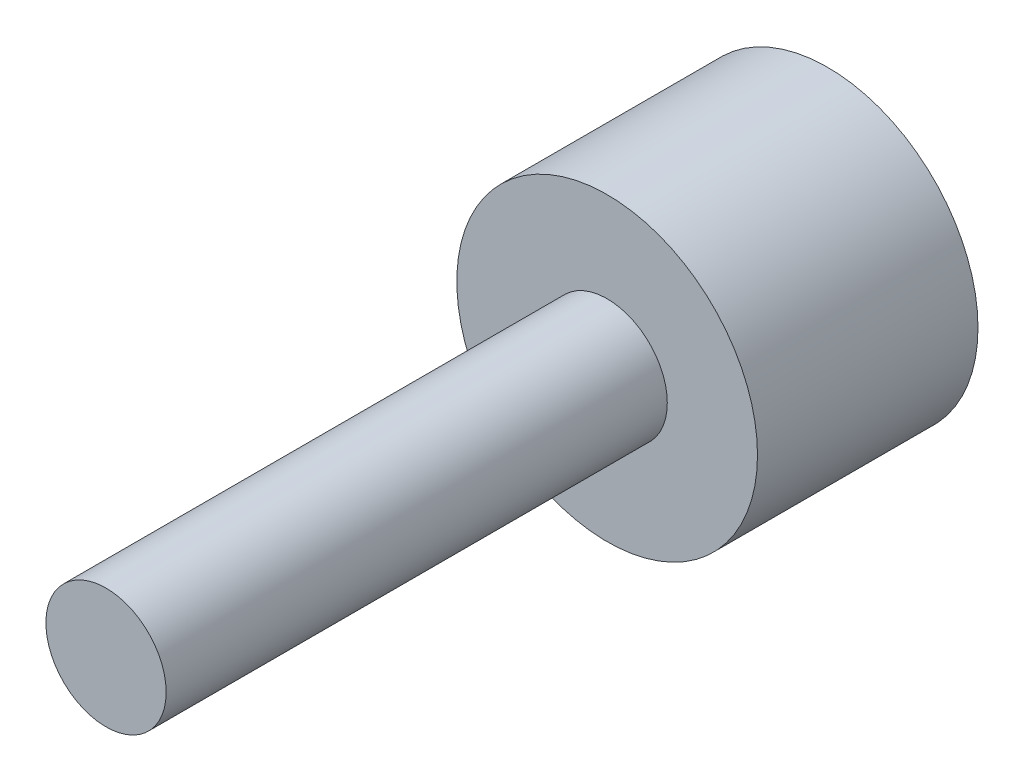
ISO-10303-21;
HEADER;
FILE_DESCRIPTION(('STEP AP214'),'2;1');
FILE_NAME('part.step','',(''),(''),'','','');
FILE_SCHEMA(('AUTOMOTIVE_DESIGN { 1 0 10303 214 1 1 1 1 }'));
ENDSEC;
DATA;
#1=APPLICATION_CONTEXT('core data for automotive mechanical design processes');
#2=APPLICATION_PROTOCOL_DEFINITION('international standard','automotive_design',2000,#1);
#3=PRODUCT_CONTEXT('',#1,'mechanical');
#4=PRODUCT('Part','Part','',(#3));
#5=PRODUCT_RELATED_PRODUCT_CATEGORY('part','',(#4));
#6=PRODUCT_DEFINITION_FORMATION('','',#4);
#7=PRODUCT_DEFINITION_CONTEXT('part definition',#1,'design');
#8=PRODUCT_DEFINITION('design','',#6,#7);
#9=PRODUCT_DEFINITION_SHAPE('','',#8);
#10=(LENGTH_UNIT() NAMED_UNIT(*) SI_UNIT(.MILLI.,.METRE.));
#11=(NAMED_UNIT(*) PLANE_ANGLE_UNIT() SI_UNIT($,.RADIAN.));
#12=(NAMED_UNIT(*) SI_UNIT($,.STERADIAN.) SOLID_ANGLE_UNIT());
#13=UNCERTAINTY_MEASURE_WITH_UNIT(LENGTH_MEASURE(1.E-05),#10,'distance_accuracy_value','');
#14=(GEOMETRIC_REPRESENTATION_CONTEXT(3) GLOBAL_UNCERTAINTY_ASSIGNED_CONTEXT((#13)) GLOBAL_UNIT_ASSIGNED_CONTEXT((#10,
#11,#12)) REPRESENTATION_CONTEXT('',''));
#15=CARTESIAN_POINT('',(0.,0.,0.));
#16=DIRECTION('',(0.,0.,1.));
#17=DIRECTION('',(1.,0.,0.));
#18=AXIS2_PLACEMENT_3D('',#15,#16,#17);
#19=CARTESIAN_POINT('',(0.,0.,5.5));
#20=DIRECTION('',(0.,0.,-1.));
#21=DIRECTION('',(-1.,0.,0.));
#22=AXIS2_PLACEMENT_3D('',#19,#20,#21);
#23=CYLINDRICAL_SURFACE('',#22,7.5);
#24=CARTESIAN_POINT('',(0.,0.,5.5));
#25=DIRECTION('',(0.,0.,1.));
#26=DIRECTION('',(1.,0.,0.));
#27=AXIS2_PLACEMENT_3D('',#24,#25,#26);
#28=CIRCLE('',#27,7.5);
#29=CARTESIAN_POINT('',(7.5,0.,5.5));
#30=VERTEX_POINT('',#29);
#31=EDGE_CURVE('E42',#30,#30,#28,.T.);
#32=ORIENTED_EDGE('',*,*,#31,.F.);
#33=EDGE_LOOP('',(#32));
#34=FACE_BOUND('',#33,.T.);
#35=CARTESIAN_POINT('',(0.,0.,-5.5));
#36=DIRECTION('',(0.,0.,1.));
#37=DIRECTION('',(1.,0.,0.));
#38=AXIS2_PLACEMENT_3D('',#35,#36,#37);
#39=CIRCLE('',#38,7.5);
#40=CARTESIAN_POINT('',(7.5,0.,-5.5));
#41=VERTEX_POINT('',#40);
#42=EDGE_CURVE('E38',#41,#41,#39,.T.);
#43=ORIENTED_EDGE('',*,*,#42,.T.);
#44=EDGE_LOOP('',(#43));
#45=FACE_BOUND('',#44,.T.);
#46=ADVANCED_FACE('F35',(#34,#45),#23,.T.);
#47=CARTESIAN_POINT('',(0.,0.,5.5));
#48=DIRECTION('',(0.,0.,1.));
#49=DIRECTION('',(1.,0.,0.));
#50=AXIS2_PLACEMENT_3D('',#47,#48,#49);
#51=PLANE('',#50);
#52=CARTESIAN_POINT('',(0.,0.,5.5));
#53=DIRECTION('',(0.,0.,1.));
#54=DIRECTION('',(1.,0.,0.));
#55=AXIS2_PLACEMENT_3D('',#52,#53,#54);
#56=CIRCLE('',#55,3.);
#57=CARTESIAN_POINT('',(3.,0.,5.5));
#58=VERTEX_POINT('',#57);
#59=EDGE_CURVE('E10',#58,#58,#56,.T.);
#60=ORIENTED_EDGE('',*,*,#59,.F.);
#61=EDGE_LOOP('',(#60));
#62=FACE_BOUND('',#61,.T.);
#63=ORIENTED_EDGE('',*,*,#31,.T.);
#64=EDGE_LOOP('',(#63));
#65=FACE_BOUND('',#64,.T.);
#66=ADVANCED_FACE('F59',(#62,#65),#51,.T.);
#67=CARTESIAN_POINT('',(0.,0.,-5.5));
#68=DIRECTION('',(0.,0.,1.));
#69=DIRECTION('',(1.,0.,0.));
#70=AXIS2_PLACEMENT_3D('',#67,#68,#69);
#71=PLANE('',#70);
#72=ORIENTED_EDGE('',*,*,#42,.F.);
#73=EDGE_LOOP('',(#72));
#74=FACE_BOUND('',#73,.T.);
#75=ADVANCED_FACE('F56',(#74),#71,.F.);
#76=CARTESIAN_POINT('',(0.,0.,30.5));
#77=DIRECTION('',(0.,0.,-1.));
#78=DIRECTION('',(-1.,0.,0.));
#79=AXIS2_PLACEMENT_3D('',#76,#77,#78);
#80=CYLINDRICAL_SURFACE('',#79,3.);
#81=CARTESIAN_POINT('',(0.,0.,30.5));
#82=DIRECTION('',(0.,0.,1.));
#83=DIRECTION('',(1.,0.,0.));
#84=AXIS2_PLACEMENT_3D('',#81,#82,#83);
#85=CIRCLE('',#84,3.);
#86=CARTESIAN_POINT('',(3.,0.,30.5));
#87=VERTEX_POINT('',#86);
#88=EDGE_CURVE('E48',#87,#87,#85,.T.);
#89=ORIENTED_EDGE('',*,*,#88,.F.);
#90=EDGE_LOOP('',(#89));
#91=FACE_BOUND('',#90,.T.);
#92=ORIENTED_EDGE('',*,*,#59,.T.);
#93=EDGE_LOOP('',(#92));
#94=FACE_BOUND('',#93,.T.);
#95=ADVANCED_FACE('F58',(#91,#94),#80,.T.);
#96=CARTESIAN_POINT('',(0.,0.,30.5));
#97=DIRECTION('',(0.,0.,1.));
#98=DIRECTION('',(1.,0.,0.));
#99=AXIS2_PLACEMENT_3D('',#96,#97,#98);
#100=PLANE('',#99);
#101=ORIENTED_EDGE('',*,*,#88,.T.);
#102=EDGE_LOOP('',(#101));
#103=FACE_BOUND('',#102,.T.);
#104=ADVANCED_FACE('F64',(#103),#100,.T.);
#105=CLOSED_SHELL('',(#46,#66,#75,#95,#104));
#106=MANIFOLD_SOLID_BREP('B2',#105);
#107=ADVANCED_BREP_SHAPE_REPRESENTATION('',(#18,#106),#14);
#108=SHAPE_DEFINITION_REPRESENTATION(#9,#107);
ENDSEC;
END-ISO-10303-21;
